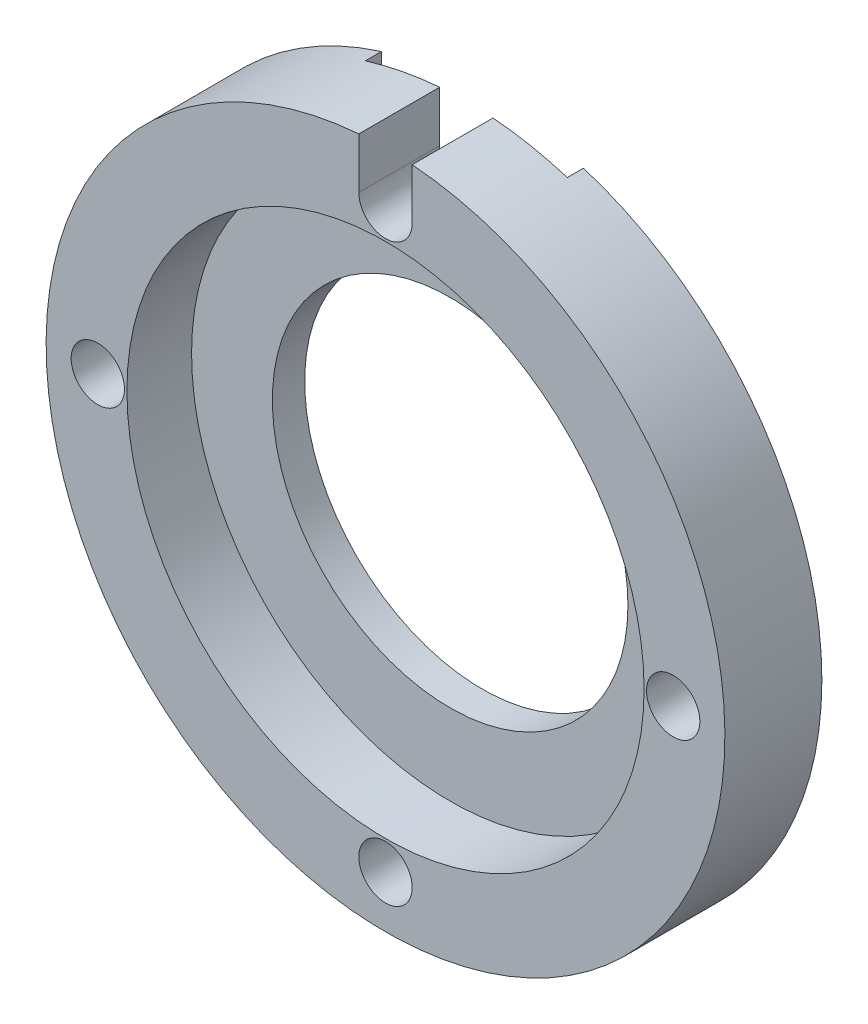
ISO-10303-21;
HEADER;
FILE_DESCRIPTION(('STEP AP214'),'2;1');
FILE_NAME('part.step','',(''),(''),'','','');
FILE_SCHEMA(('AUTOMOTIVE_DESIGN { 1 0 10303 214 1 1 1 1 }'));
ENDSEC;
DATA;
#1=APPLICATION_CONTEXT('core data for automotive mechanical design processes');
#2=APPLICATION_PROTOCOL_DEFINITION('international standard','automotive_design',2000,#1);
#3=PRODUCT_CONTEXT('',#1,'mechanical');
#4=PRODUCT('Part','Part','',(#3));
#5=PRODUCT_RELATED_PRODUCT_CATEGORY('part','',(#4));
#6=PRODUCT_DEFINITION_FORMATION('','',#4);
#7=PRODUCT_DEFINITION_CONTEXT('part definition',#1,'design');
#8=PRODUCT_DEFINITION('design','',#6,#7);
#9=PRODUCT_DEFINITION_SHAPE('','',#8);
#10=(LENGTH_UNIT() NAMED_UNIT(*) SI_UNIT(.MILLI.,.METRE.));
#11=(NAMED_UNIT(*) PLANE_ANGLE_UNIT() SI_UNIT($,.RADIAN.));
#12=(NAMED_UNIT(*) SI_UNIT($,.STERADIAN.) SOLID_ANGLE_UNIT());
#13=UNCERTAINTY_MEASURE_WITH_UNIT(LENGTH_MEASURE(1.E-05),#10,'distance_accuracy_value','');
#14=(GEOMETRIC_REPRESENTATION_CONTEXT(3) GLOBAL_UNCERTAINTY_ASSIGNED_CONTEXT((#13)) GLOBAL_UNIT_ASSIGNED_CONTEXT((#10,
#11,#12)) REPRESENTATION_CONTEXT('',''));
#15=CARTESIAN_POINT('',(0.,0.,0.));
#16=DIRECTION('',(0.,0.,1.));
#17=DIRECTION('',(1.,0.,0.));
#18=AXIS2_PLACEMENT_3D('',#15,#16,#17);
#19=CARTESIAN_POINT('',(0.,17.8,-0.00100000000000013));
#20=DIRECTION('',(0.,0.,1.));
#21=DIRECTION('',(1.,0.,0.));
#22=AXIS2_PLACEMENT_3D('',#19,#20,#21);
#23=CYLINDRICAL_SURFACE('',#22,1.65);
#24=CARTESIAN_POINT('',(0.,17.8,1.));
#25=DIRECTION('',(0.,0.,-1.));
#26=DIRECTION('',(-1.,0.,0.));
#27=AXIS2_PLACEMENT_3D('',#24,#25,#26);
#28=CIRCLE('',#27,1.65);
#29=CARTESIAN_POINT('',(-1.64999999999999,17.8,1.));
#30=VERTEX_POINT('',#29);
#31=CARTESIAN_POINT('',(1.65,17.8,1.));
#32=VERTEX_POINT('',#31);
#33=EDGE_CURVE('E137',#30,#32,#28,.F.);
#34=ORIENTED_EDGE('',*,*,#33,.F.);
#35=DIRECTION('',(0.,0.,1.));
#36=VECTOR('',#35,1.);
#37=CARTESIAN_POINT('',(-1.64999999999999,17.8,-0.00100000000000013));
#38=LINE('',#37,#36);
#39=CARTESIAN_POINT('',(-1.64999999999999,17.8,6.));
#40=VERTEX_POINT('',#39);
#41=EDGE_CURVE('E63',#30,#40,#38,.T.);
#42=ORIENTED_EDGE('',*,*,#41,.T.);
#43=CARTESIAN_POINT('',(0.,17.8,6.));
#44=DIRECTION('',(0.,0.,1.));
#45=DIRECTION('',(1.,0.,0.));
#46=AXIS2_PLACEMENT_3D('',#43,#44,#45);
#47=CIRCLE('',#46,1.65);
#48=CARTESIAN_POINT('',(1.65,17.8,6.));
#49=VERTEX_POINT('',#48);
#50=EDGE_CURVE('E149',#40,#49,#47,.T.);
#51=ORIENTED_EDGE('',*,*,#50,.T.);
#52=DIRECTION('',(0.,0.,1.));
#53=VECTOR('',#52,1.);
#54=CARTESIAN_POINT('',(1.65,17.8,-0.00100000000000013));
#55=LINE('',#54,#53);
#56=EDGE_CURVE('E147',#32,#49,#55,.T.);
#57=ORIENTED_EDGE('',*,*,#56,.F.);
#58=EDGE_LOOP('',(#34,#42,#51,#57));
#59=FACE_BOUND('',#58,.T.);
#60=ADVANCED_FACE('F41',(#59),#23,.F.);
#61=CARTESIAN_POINT('',(1.65,17.8,-0.00100000000000013));
#62=DIRECTION('',(1.,0.,0.));
#63=DIRECTION('',(0.,0.,-1.));
#64=AXIS2_PLACEMENT_3D('',#61,#62,#63);
#65=PLANE('',#64);
#66=DIRECTION('',(0.,1.,0.));
#67=VECTOR('',#66,1.);
#68=CARTESIAN_POINT('',(1.65,17.8,1.));
#69=LINE('',#68,#67);
#70=CARTESIAN_POINT('',(1.65,20.9350782181486,1.));
#71=VERTEX_POINT('',#70);
#72=EDGE_CURVE('E139',#32,#71,#69,.T.);
#73=ORIENTED_EDGE('',*,*,#72,.F.);
#74=ORIENTED_EDGE('',*,*,#56,.T.);
#75=DIRECTION('',(0.,1.,0.));
#76=VECTOR('',#75,1.);
#77=CARTESIAN_POINT('',(1.65,17.8,6.));
#78=LINE('',#77,#76);
#79=CARTESIAN_POINT('',(1.65,20.9350782181486,6.));
#80=VERTEX_POINT('',#79);
#81=EDGE_CURVE('E142',#49,#80,#78,.T.);
#82=ORIENTED_EDGE('',*,*,#81,.T.);
#83=DIRECTION('',(0.,0.,1.));
#84=VECTOR('',#83,1.);
#85=CARTESIAN_POINT('',(1.65,20.9350782181486,-0.00100000000000013));
#86=LINE('',#85,#84);
#87=EDGE_CURVE('E152',#71,#80,#86,.T.);
#88=ORIENTED_EDGE('',*,*,#87,.F.);
#89=EDGE_LOOP('',(#73,#74,#82,#88));
#90=FACE_BOUND('',#89,.T.);
#91=ADVANCED_FACE('F210',(#90),#65,.F.);
#92=CARTESIAN_POINT('',(-1.64999999999999,17.8,-0.00100000000000013));
#93=DIRECTION('',(-1.,0.,0.));
#94=DIRECTION('',(0.,0.,1.));
#95=AXIS2_PLACEMENT_3D('',#92,#93,#94);
#96=PLANE('',#95);
#97=DIRECTION('',(0.,-1.,0.));
#98=VECTOR('',#97,1.);
#99=CARTESIAN_POINT('',(-1.64999999999999,17.8,1.));
#100=LINE('',#99,#98);
#101=CARTESIAN_POINT('',(-1.64999999999999,20.9350782181486,1.));
#102=VERTEX_POINT('',#101);
#103=EDGE_CURVE('E11',#102,#30,#100,.T.);
#104=ORIENTED_EDGE('',*,*,#103,.F.);
#105=DIRECTION('',(0.,0.,1.));
#106=VECTOR('',#105,1.);
#107=CARTESIAN_POINT('',(-1.64999999999999,20.9350782181486,-0.00100000000000013));
#108=LINE('',#107,#106);
#109=CARTESIAN_POINT('',(-1.64999999999999,20.9350782181486,6.));
#110=VERTEX_POINT('',#109);
#111=EDGE_CURVE('E150',#102,#110,#108,.T.);
#112=ORIENTED_EDGE('',*,*,#111,.T.);
#113=DIRECTION('',(0.,-1.,0.));
#114=VECTOR('',#113,1.);
#115=CARTESIAN_POINT('',(-1.64999999999999,17.8,6.));
#116=LINE('',#115,#114);
#117=EDGE_CURVE('E145',#110,#40,#116,.T.);
#118=ORIENTED_EDGE('',*,*,#117,.T.);
#119=ORIENTED_EDGE('',*,*,#41,.F.);
#120=EDGE_LOOP('',(#104,#112,#118,#119));
#121=FACE_BOUND('',#120,.T.);
#122=ADVANCED_FACE('F216',(#121),#96,.F.);
#123=CARTESIAN_POINT('',(0.,0.,2.));
#124=DIRECTION('',(0.,0.,1.));
#125=DIRECTION('',(1.,0.,0.));
#126=AXIS2_PLACEMENT_3D('',#123,#124,#125);
#127=PLANE('',#126);
#128=CARTESIAN_POINT('',(0.,0.,2.));
#129=DIRECTION('',(0.,0.,1.));
#130=DIRECTION('',(1.,0.,0.));
#131=AXIS2_PLACEMENT_3D('',#128,#129,#130);
#132=CIRCLE('',#131,11.);
#133=CARTESIAN_POINT('',(11.,0.,2.));
#134=VERTEX_POINT('',#133);
#135=EDGE_CURVE('E183',#134,#134,#132,.T.);
#136=ORIENTED_EDGE('',*,*,#135,.F.);
#137=EDGE_LOOP('',(#136));
#138=FACE_BOUND('',#137,.T.);
#139=CARTESIAN_POINT('',(0.,0.,2.));
#140=DIRECTION('',(0.,0.,1.));
#141=DIRECTION('',(1.,0.,0.));
#142=AXIS2_PLACEMENT_3D('',#139,#140,#141);
#143=CIRCLE('',#142,16.);
#144=CARTESIAN_POINT('',(16.,0.,2.));
#145=VERTEX_POINT('',#144);
#146=EDGE_CURVE('E162',#145,#145,#143,.T.);
#147=ORIENTED_EDGE('',*,*,#146,.T.);
#148=EDGE_LOOP('',(#147));
#149=FACE_BOUND('',#148,.T.);
#150=ADVANCED_FACE('F232',(#138,#149),#127,.T.);
#151=CARTESIAN_POINT('',(0.,0.,0.));
#152=DIRECTION('',(0.,0.,1.));
#153=DIRECTION('',(1.,0.,0.));
#154=AXIS2_PLACEMENT_3D('',#151,#152,#153);
#155=PLANE('',#154);
#156=CARTESIAN_POINT('',(17.8,0.,0.));
#157=DIRECTION('',(0.,0.,1.));
#158=DIRECTION('',(1.,0.,0.));
#159=AXIS2_PLACEMENT_3D('',#156,#157,#158);
#160=CIRCLE('',#159,1.65);
#161=CARTESIAN_POINT('',(19.45,0.,0.));
#162=VERTEX_POINT('',#161);
#163=EDGE_CURVE('E158',#162,#162,#160,.F.);
#164=ORIENTED_EDGE('',*,*,#163,.F.);
#165=EDGE_LOOP('',(#164));
#166=FACE_BOUND('',#165,.T.);
#167=CARTESIAN_POINT('',(0.,-17.8,0.));
#168=DIRECTION('',(0.,0.,1.));
#169=DIRECTION('',(1.,0.,0.));
#170=AXIS2_PLACEMENT_3D('',#167,#168,#169);
#171=CIRCLE('',#170,1.65);
#172=CARTESIAN_POINT('',(1.65,-17.8,0.));
#173=VERTEX_POINT('',#172);
#174=EDGE_CURVE('E163',#173,#173,#171,.F.);
#175=ORIENTED_EDGE('',*,*,#174,.F.);
#176=EDGE_LOOP('',(#175));
#177=FACE_BOUND('',#176,.T.);
#178=CARTESIAN_POINT('',(-17.8,0.,0.));
#179=DIRECTION('',(0.,0.,1.));
#180=DIRECTION('',(1.,0.,0.));
#181=AXIS2_PLACEMENT_3D('',#178,#179,#180);
#182=CIRCLE('',#181,1.65);
#183=CARTESIAN_POINT('',(-16.15,0.,0.));
#184=VERTEX_POINT('',#183);
#185=EDGE_CURVE('E169',#184,#184,#182,.F.);
#186=ORIENTED_EDGE('',*,*,#185,.F.);
#187=EDGE_LOOP('',(#186));
#188=FACE_BOUND('',#187,.T.);
#189=CARTESIAN_POINT('',(0.,0.,0.));
#190=DIRECTION('',(0.,0.,1.));
#191=DIRECTION('',(1.,0.,0.));
#192=AXIS2_PLACEMENT_3D('',#189,#190,#191);
#193=CIRCLE('',#192,11.);
#194=CARTESIAN_POINT('',(-6.24999999999999,9.05193349511584,0.));
#195=VERTEX_POINT('',#194);
#196=CARTESIAN_POINT('',(6.25000000000002,9.05193349511582,0.));
#197=VERTEX_POINT('',#196);
#198=EDGE_CURVE('E130',#195,#197,#193,.T.);
#199=ORIENTED_EDGE('',*,*,#198,.T.);
#200=DIRECTION('',(0.,-1.,0.));
#201=VECTOR('',#200,1.);
#202=CARTESIAN_POINT('',(6.25000000000002,9.05193349511582,0.));
#203=LINE('',#202,#201);
#204=CARTESIAN_POINT('',(6.25000000000001,20.0483789868408,0.));
#205=VERTEX_POINT('',#204);
#206=EDGE_CURVE('E124',#205,#197,#203,.T.);
#207=ORIENTED_EDGE('',*,*,#206,.F.);
#208=CARTESIAN_POINT('',(0.,0.,0.));
#209=DIRECTION('',(0.,0.,1.));
#210=DIRECTION('',(1.,0.,0.));
#211=AXIS2_PLACEMENT_3D('',#208,#209,#210);
#212=CIRCLE('',#211,21.);
#213=CARTESIAN_POINT('',(-6.24999999999999,20.0483789868408,0.));
#214=VERTEX_POINT('',#213);
#215=EDGE_CURVE('E49',#214,#205,#212,.T.);
#216=ORIENTED_EDGE('',*,*,#215,.F.);
#217=DIRECTION('',(0.,1.,0.));
#218=VECTOR('',#217,1.);
#219=CARTESIAN_POINT('',(-6.24999999999999,9.05193349511584,0.));
#220=LINE('',#219,#218);
#221=EDGE_CURVE('E194',#195,#214,#220,.T.);
#222=ORIENTED_EDGE('',*,*,#221,.F.);
#223=EDGE_LOOP('',(#199,#207,#216,#222));
#224=FACE_BOUND('',#223,.T.);
#225=ADVANCED_FACE('F193',(#166,#177,#188,#224),#155,.F.);
#226=CARTESIAN_POINT('',(0.,0.,2.));
#227=DIRECTION('',(0.,0.,-1.));
#228=DIRECTION('',(-1.,0.,0.));
#229=AXIS2_PLACEMENT_3D('',#226,#227,#228);
#230=CYLINDRICAL_SURFACE('',#229,21.);
#231=CARTESIAN_POINT('',(0.,0.,1.));
#232=DIRECTION('',(0.,0.,-1.));
#233=DIRECTION('',(-1.,0.,0.));
#234=AXIS2_PLACEMENT_3D('',#231,#232,#233);
#235=CIRCLE('',#234,21.);
#236=CARTESIAN_POINT('',(-6.24999999999999,20.0483789868408,1.));
#237=VERTEX_POINT('',#236);
#238=EDGE_CURVE('E55',#237,#102,#235,.T.);
#239=ORIENTED_EDGE('',*,*,#238,.F.);
#240=DIRECTION('',(0.,0.,-1.));
#241=VECTOR('',#240,1.);
#242=CARTESIAN_POINT('',(-6.24999999999999,20.0483789868408,1.));
#243=LINE('',#242,#241);
#244=EDGE_CURVE('E113',#237,#214,#243,.T.);
#245=ORIENTED_EDGE('',*,*,#244,.T.);
#246=ORIENTED_EDGE('',*,*,#215,.T.);
#247=DIRECTION('',(0.,0.,-1.));
#248=VECTOR('',#247,1.);
#249=CARTESIAN_POINT('',(6.25000000000001,20.0483789868408,1.));
#250=LINE('',#249,#248);
#251=CARTESIAN_POINT('',(6.25000000000001,20.0483789868408,1.));
#252=VERTEX_POINT('',#251);
#253=EDGE_CURVE('E132',#252,#205,#250,.T.);
#254=ORIENTED_EDGE('',*,*,#253,.F.);
#255=EDGE_CURVE('E114',#71,#252,#235,.T.);
#256=ORIENTED_EDGE('',*,*,#255,.F.);
#257=ORIENTED_EDGE('',*,*,#87,.T.);
#258=CARTESIAN_POINT('',(0.,0.,6.));
#259=DIRECTION('',(0.,0.,1.));
#260=DIRECTION('',(1.,0.,0.));
#261=AXIS2_PLACEMENT_3D('',#258,#259,#260);
#262=CIRCLE('',#261,21.);
#263=EDGE_CURVE('E178',#110,#80,#262,.T.);
#264=ORIENTED_EDGE('',*,*,#263,.F.);
#265=ORIENTED_EDGE('',*,*,#111,.F.);
#266=EDGE_LOOP('',(#239,#245,#246,#254,#256,#257,#264,#265));
#267=FACE_BOUND('',#266,.T.);
#268=ADVANCED_FACE('F43',(#267),#230,.T.);
#269=CARTESIAN_POINT('',(0.,0.,2.));
#270=DIRECTION('',(0.,0.,-1.));
#271=DIRECTION('',(-1.,0.,0.));
#272=AXIS2_PLACEMENT_3D('',#269,#270,#271);
#273=CYLINDRICAL_SURFACE('',#272,11.);
#274=DIRECTION('',(0.,0.,-1.));
#275=VECTOR('',#274,1.);
#276=CARTESIAN_POINT('',(6.25000000000002,9.05193349511582,1.));
#277=LINE('',#276,#275);
#278=CARTESIAN_POINT('',(6.25000000000002,9.05193349511582,1.));
#279=VERTEX_POINT('',#278);
#280=EDGE_CURVE('E140',#279,#197,#277,.T.);
#281=ORIENTED_EDGE('',*,*,#280,.T.);
#282=ORIENTED_EDGE('',*,*,#198,.F.);
#283=DIRECTION('',(0.,0.,-1.));
#284=VECTOR('',#283,1.);
#285=CARTESIAN_POINT('',(-6.24999999999999,9.05193349511584,1.));
#286=LINE('',#285,#284);
#287=CARTESIAN_POINT('',(-6.24999999999999,9.05193349511584,1.));
#288=VERTEX_POINT('',#287);
#289=EDGE_CURVE('E110',#288,#195,#286,.T.);
#290=ORIENTED_EDGE('',*,*,#289,.F.);
#291=CARTESIAN_POINT('',(0.,0.,1.));
#292=DIRECTION('',(0.,0.,1.));
#293=DIRECTION('',(-1.,0.,0.));
#294=AXIS2_PLACEMENT_3D('',#291,#292,#293);
#295=CIRCLE('',#294,11.);
#296=EDGE_CURVE('E115',#279,#288,#295,.T.);
#297=ORIENTED_EDGE('',*,*,#296,.F.);
#298=EDGE_LOOP('',(#281,#282,#290,#297));
#299=FACE_BOUND('',#298,.T.);
#300=ORIENTED_EDGE('',*,*,#135,.T.);
#301=EDGE_LOOP('',(#300));
#302=FACE_BOUND('',#301,.T.);
#303=ADVANCED_FACE('F127',(#299,#302),#273,.F.);
#304=CARTESIAN_POINT('',(0.,0.,6.));
#305=DIRECTION('',(0.,0.,1.));
#306=DIRECTION('',(1.,0.,0.));
#307=AXIS2_PLACEMENT_3D('',#304,#305,#306);
#308=PLANE('',#307);
#309=ORIENTED_EDGE('',*,*,#117,.F.);
#310=ORIENTED_EDGE('',*,*,#263,.T.);
#311=ORIENTED_EDGE('',*,*,#81,.F.);
#312=ORIENTED_EDGE('',*,*,#50,.F.);
#313=EDGE_LOOP('',(#309,#310,#311,#312));
#314=FACE_BOUND('',#313,.T.);
#315=CARTESIAN_POINT('',(17.8,0.,6.));
#316=DIRECTION('',(0.,0.,1.));
#317=DIRECTION('',(1.,0.,0.));
#318=AXIS2_PLACEMENT_3D('',#315,#316,#317);
#319=CIRCLE('',#318,1.65);
#320=CARTESIAN_POINT('',(19.45,0.,6.));
#321=VERTEX_POINT('',#320);
#322=EDGE_CURVE('E155',#321,#321,#319,.T.);
#323=ORIENTED_EDGE('',*,*,#322,.F.);
#324=EDGE_LOOP('',(#323));
#325=FACE_BOUND('',#324,.T.);
#326=CARTESIAN_POINT('',(0.,-17.8,6.));
#327=DIRECTION('',(0.,0.,1.));
#328=DIRECTION('',(1.,0.,0.));
#329=AXIS2_PLACEMENT_3D('',#326,#327,#328);
#330=CIRCLE('',#329,1.65);
#331=CARTESIAN_POINT('',(1.65,-17.8,6.));
#332=VERTEX_POINT('',#331);
#333=EDGE_CURVE('E159',#332,#332,#330,.T.);
#334=ORIENTED_EDGE('',*,*,#333,.F.);
#335=EDGE_LOOP('',(#334));
#336=FACE_BOUND('',#335,.T.);
#337=CARTESIAN_POINT('',(-17.8,0.,6.));
#338=DIRECTION('',(0.,0.,1.));
#339=DIRECTION('',(1.,0.,0.));
#340=AXIS2_PLACEMENT_3D('',#337,#338,#339);
#341=CIRCLE('',#340,1.65);
#342=CARTESIAN_POINT('',(-16.15,0.,6.));
#343=VERTEX_POINT('',#342);
#344=EDGE_CURVE('E166',#343,#343,#341,.T.);
#345=ORIENTED_EDGE('',*,*,#344,.F.);
#346=EDGE_LOOP('',(#345));
#347=FACE_BOUND('',#346,.T.);
#348=CARTESIAN_POINT('',(0.,0.,6.));
#349=DIRECTION('',(0.,0.,1.));
#350=DIRECTION('',(1.,0.,0.));
#351=AXIS2_PLACEMENT_3D('',#348,#349,#350);
#352=CIRCLE('',#351,16.);
#353=CARTESIAN_POINT('',(16.,0.,6.));
#354=VERTEX_POINT('',#353);
#355=EDGE_CURVE('E175',#354,#354,#352,.T.);
#356=ORIENTED_EDGE('',*,*,#355,.F.);
#357=EDGE_LOOP('',(#356));
#358=FACE_BOUND('',#357,.T.);
#359=ADVANCED_FACE('F226',(#314,#325,#336,#347,#358),#308,.T.);
#360=CARTESIAN_POINT('',(0.,0.,6.));
#361=DIRECTION('',(0.,0.,-1.));
#362=DIRECTION('',(-1.,0.,0.));
#363=AXIS2_PLACEMENT_3D('',#360,#361,#362);
#364=CYLINDRICAL_SURFACE('',#363,16.);
#365=ORIENTED_EDGE('',*,*,#355,.T.);
#366=EDGE_LOOP('',(#365));
#367=FACE_BOUND('',#366,.T.);
#368=ORIENTED_EDGE('',*,*,#146,.F.);
#369=EDGE_LOOP('',(#368));
#370=FACE_BOUND('',#369,.T.);
#371=ADVANCED_FACE('F223',(#367,#370),#364,.F.);
#372=CARTESIAN_POINT('',(-17.8,0.,-0.00100000000000013));
#373=DIRECTION('',(0.,0.,1.));
#374=DIRECTION('',(1.,0.,0.));
#375=AXIS2_PLACEMENT_3D('',#372,#373,#374);
#376=CYLINDRICAL_SURFACE('',#375,1.65);
#377=CARTESIAN_POINT('',(-16.15,0.,6.));
#378=CARTESIAN_POINT('',(-16.15,0.,5.9375));
#379=CARTESIAN_POINT('',(-16.15,0.,5.875));
#380=CARTESIAN_POINT('',(-16.15,0.,5.75));
#381=CARTESIAN_POINT('',(-16.15,0.,5.6875));
#382=CARTESIAN_POINT('',(-16.15,0.,5.5625));
#383=CARTESIAN_POINT('',(-16.15,0.,5.5));
#384=CARTESIAN_POINT('',(-16.15,0.,5.375));
#385=CARTESIAN_POINT('',(-16.15,0.,5.3125));
#386=CARTESIAN_POINT('',(-16.15,0.,5.1875));
#387=CARTESIAN_POINT('',(-16.15,0.,5.125));
#388=CARTESIAN_POINT('',(-16.15,0.,5.));
#389=CARTESIAN_POINT('',(-16.15,0.,4.9375));
#390=CARTESIAN_POINT('',(-16.15,0.,4.8125));
#391=CARTESIAN_POINT('',(-16.15,0.,4.75));
#392=CARTESIAN_POINT('',(-16.15,0.,4.625));
#393=CARTESIAN_POINT('',(-16.15,0.,4.5625));
#394=CARTESIAN_POINT('',(-16.15,0.,4.4375));
#395=CARTESIAN_POINT('',(-16.15,0.,4.375));
#396=CARTESIAN_POINT('',(-16.15,0.,4.25));
#397=CARTESIAN_POINT('',(-16.15,0.,4.1875));
#398=CARTESIAN_POINT('',(-16.15,0.,4.0625));
#399=CARTESIAN_POINT('',(-16.15,0.,4.));
#400=CARTESIAN_POINT('',(-16.15,0.,3.875));
#401=CARTESIAN_POINT('',(-16.15,0.,3.8125));
#402=CARTESIAN_POINT('',(-16.15,0.,3.6875));
#403=CARTESIAN_POINT('',(-16.15,0.,3.625));
#404=CARTESIAN_POINT('',(-16.15,0.,3.5));
#405=CARTESIAN_POINT('',(-16.15,0.,3.4375));
#406=CARTESIAN_POINT('',(-16.15,0.,3.3125));
#407=CARTESIAN_POINT('',(-16.15,0.,3.25));
#408=CARTESIAN_POINT('',(-16.15,0.,3.125));
#409=CARTESIAN_POINT('',(-16.15,0.,3.0625));
#410=CARTESIAN_POINT('',(-16.15,0.,2.9375));
#411=CARTESIAN_POINT('',(-16.15,0.,2.875));
#412=CARTESIAN_POINT('',(-16.15,0.,2.75));
#413=CARTESIAN_POINT('',(-16.15,0.,2.6875));
#414=CARTESIAN_POINT('',(-16.15,0.,2.5625));
#415=CARTESIAN_POINT('',(-16.15,0.,2.5));
#416=CARTESIAN_POINT('',(-16.15,0.,2.375));
#417=CARTESIAN_POINT('',(-16.15,0.,2.3125));
#418=CARTESIAN_POINT('',(-16.15,0.,2.1875));
#419=CARTESIAN_POINT('',(-16.15,0.,2.125));
#420=CARTESIAN_POINT('',(-16.15,0.,2.));
#421=CARTESIAN_POINT('',(-16.15,0.,1.9375));
#422=CARTESIAN_POINT('',(-16.15,0.,1.8125));
#423=CARTESIAN_POINT('',(-16.15,0.,1.75));
#424=CARTESIAN_POINT('',(-16.15,0.,1.625));
#425=CARTESIAN_POINT('',(-16.15,0.,1.5625));
#426=CARTESIAN_POINT('',(-16.15,0.,1.4375));
#427=CARTESIAN_POINT('',(-16.15,0.,1.375));
#428=CARTESIAN_POINT('',(-16.15,0.,1.25));
#429=CARTESIAN_POINT('',(-16.15,0.,1.1875));
#430=CARTESIAN_POINT('',(-16.15,0.,1.0625));
#431=CARTESIAN_POINT('',(-16.15,0.,1.));
#432=CARTESIAN_POINT('',(-16.15,0.,0.875));
#433=CARTESIAN_POINT('',(-16.15,0.,0.8125));
#434=CARTESIAN_POINT('',(-16.15,0.,0.6875));
#435=CARTESIAN_POINT('',(-16.15,0.,0.625));
#436=CARTESIAN_POINT('',(-16.15,0.,0.5));
#437=CARTESIAN_POINT('',(-16.15,0.,0.4375));
#438=CARTESIAN_POINT('',(-16.15,0.,0.3125));
#439=CARTESIAN_POINT('',(-16.15,0.,0.25));
#440=CARTESIAN_POINT('',(-16.15,0.,0.125));
#441=CARTESIAN_POINT('',(-16.15,0.,0.0625000000000001));
#442=CARTESIAN_POINT('',(-16.15,0.,0.));
#443=B_SPLINE_CURVE_WITH_KNOTS('',3,(#377,#378,#379,#380,#381,#382,#383,#384,#385,#386,#387,
#388,#389,#390,#391,#392,#393,#394,#395,#396,#397,#398,#399,#400,#401,#402,#403,#404,#405,#406,
#407,#408,#409,#410,#411,#412,#413,#414,#415,#416,#417,#418,#419,#420,#421,#422,#423,#424,#425,
#426,#427,#428,#429,#430,#431,#432,#433,#434,#435,#436,#437,#438,#439,#440,#441,#442),
.UNSPECIFIED.,.F.,.F.,(4,2,2,2,2,2,2,2,2,2,2,2,2,2,2,2,2,2,2,2,2,2,2,2,2,2,2,2,2,2,2,2,4),(0.,
0.1875,0.375,0.5625,0.75,0.9375,1.125,1.3125,1.5,1.6875,1.875,2.0625,2.25,2.4375,2.625,2.8125,
3.,3.1875,3.375,3.5625,3.75,3.9375,4.125,4.3125,4.5,4.6875,4.875,5.0625,5.25,5.4375,5.625,
5.8125,6.),.UNSPECIFIED.);
#444=EDGE_CURVE('BSEAM221',#343,#184,#443,.T.);
#445=ORIENTED_EDGE('',*,*,#344,.T.);
#446=ORIENTED_EDGE('',*,*,#185,.T.);
#447=ORIENTED_EDGE('',*,*,#444,.T.);
#448=ORIENTED_EDGE('',*,*,#444,.F.);
#449=EDGE_LOOP('',(#445,#447,#446,#448));
#450=FACE_BOUND('',#449,.T.);
#451=ADVANCED_FACE('F221',(#450),#376,.F.);
#452=CARTESIAN_POINT('',(0.,-17.8,-0.00100000000000013));
#453=DIRECTION('',(0.,0.,1.));
#454=DIRECTION('',(1.,0.,0.));
#455=AXIS2_PLACEMENT_3D('',#452,#453,#454);
#456=CYLINDRICAL_SURFACE('',#455,1.65);
#457=CARTESIAN_POINT('',(1.65,-17.8,6.));
#458=CARTESIAN_POINT('',(1.65,-17.8,5.9375));
#459=CARTESIAN_POINT('',(1.65,-17.8,5.875));
#460=CARTESIAN_POINT('',(1.65,-17.8,5.75));
#461=CARTESIAN_POINT('',(1.65,-17.8,5.6875));
#462=CARTESIAN_POINT('',(1.65,-17.8,5.5625));
#463=CARTESIAN_POINT('',(1.65,-17.8,5.5));
#464=CARTESIAN_POINT('',(1.65,-17.8,5.375));
#465=CARTESIAN_POINT('',(1.65,-17.8,5.3125));
#466=CARTESIAN_POINT('',(1.65,-17.8,5.1875));
#467=CARTESIAN_POINT('',(1.65,-17.8,5.125));
#468=CARTESIAN_POINT('',(1.65,-17.8,5.));
#469=CARTESIAN_POINT('',(1.65,-17.8,4.9375));
#470=CARTESIAN_POINT('',(1.65,-17.8,4.8125));
#471=CARTESIAN_POINT('',(1.65,-17.8,4.75));
#472=CARTESIAN_POINT('',(1.65,-17.8,4.625));
#473=CARTESIAN_POINT('',(1.65,-17.8,4.5625));
#474=CARTESIAN_POINT('',(1.65,-17.8,4.4375));
#475=CARTESIAN_POINT('',(1.65,-17.8,4.375));
#476=CARTESIAN_POINT('',(1.65,-17.8,4.25));
#477=CARTESIAN_POINT('',(1.65,-17.8,4.1875));
#478=CARTESIAN_POINT('',(1.65,-17.8,4.0625));
#479=CARTESIAN_POINT('',(1.65,-17.8,4.));
#480=CARTESIAN_POINT('',(1.65,-17.8,3.875));
#481=CARTESIAN_POINT('',(1.65,-17.8,3.8125));
#482=CARTESIAN_POINT('',(1.65,-17.8,3.6875));
#483=CARTESIAN_POINT('',(1.65,-17.8,3.625));
#484=CARTESIAN_POINT('',(1.65,-17.8,3.5));
#485=CARTESIAN_POINT('',(1.65,-17.8,3.4375));
#486=CARTESIAN_POINT('',(1.65,-17.8,3.3125));
#487=CARTESIAN_POINT('',(1.65,-17.8,3.25));
#488=CARTESIAN_POINT('',(1.65,-17.8,3.125));
#489=CARTESIAN_POINT('',(1.65,-17.8,3.0625));
#490=CARTESIAN_POINT('',(1.65,-17.8,2.9375));
#491=CARTESIAN_POINT('',(1.65,-17.8,2.875));
#492=CARTESIAN_POINT('',(1.65,-17.8,2.75));
#493=CARTESIAN_POINT('',(1.65,-17.8,2.6875));
#494=CARTESIAN_POINT('',(1.65,-17.8,2.5625));
#495=CARTESIAN_POINT('',(1.65,-17.8,2.5));
#496=CARTESIAN_POINT('',(1.65,-17.8,2.375));
#497=CARTESIAN_POINT('',(1.65,-17.8,2.3125));
#498=CARTESIAN_POINT('',(1.65,-17.8,2.1875));
#499=CARTESIAN_POINT('',(1.65,-17.8,2.125));
#500=CARTESIAN_POINT('',(1.65,-17.8,2.));
#501=CARTESIAN_POINT('',(1.65,-17.8,1.9375));
#502=CARTESIAN_POINT('',(1.65,-17.8,1.8125));
#503=CARTESIAN_POINT('',(1.65,-17.8,1.75));
#504=CARTESIAN_POINT('',(1.65,-17.8,1.625));
#505=CARTESIAN_POINT('',(1.65,-17.8,1.5625));
#506=CARTESIAN_POINT('',(1.65,-17.8,1.4375));
#507=CARTESIAN_POINT('',(1.65,-17.8,1.375));
#508=CARTESIAN_POINT('',(1.65,-17.8,1.25));
#509=CARTESIAN_POINT('',(1.65,-17.8,1.1875));
#510=CARTESIAN_POINT('',(1.65,-17.8,1.0625));
#511=CARTESIAN_POINT('',(1.65,-17.8,1.));
#512=CARTESIAN_POINT('',(1.65,-17.8,0.875));
#513=CARTESIAN_POINT('',(1.65,-17.8,0.8125));
#514=CARTESIAN_POINT('',(1.65,-17.8,0.6875));
#515=CARTESIAN_POINT('',(1.65,-17.8,0.625));
#516=CARTESIAN_POINT('',(1.65,-17.8,0.5));
#517=CARTESIAN_POINT('',(1.65,-17.8,0.4375));
#518=CARTESIAN_POINT('',(1.65,-17.8,0.3125));
#519=CARTESIAN_POINT('',(1.65,-17.8,0.25));
#520=CARTESIAN_POINT('',(1.65,-17.8,0.125));
#521=CARTESIAN_POINT('',(1.65,-17.8,0.0625000000000001));
#522=CARTESIAN_POINT('',(1.65,-17.8,0.));
#523=B_SPLINE_CURVE_WITH_KNOTS('',3,(#457,#458,#459,#460,#461,#462,#463,#464,#465,#466,#467,
#468,#469,#470,#471,#472,#473,#474,#475,#476,#477,#478,#479,#480,#481,#482,#483,#484,#485,#486,
#487,#488,#489,#490,#491,#492,#493,#494,#495,#496,#497,#498,#499,#500,#501,#502,#503,#504,#505,
#506,#507,#508,#509,#510,#511,#512,#513,#514,#515,#516,#517,#518,#519,#520,#521,#522),
.UNSPECIFIED.,.F.,.F.,(4,2,2,2,2,2,2,2,2,2,2,2,2,2,2,2,2,2,2,2,2,2,2,2,2,2,2,2,2,2,2,2,4),(0.,
0.1875,0.375,0.5625,0.75,0.9375,1.125,1.3125,1.5,1.6875,1.875,2.0625,2.25,2.4375,2.625,2.8125,
3.,3.1875,3.375,3.5625,3.75,3.9375,4.125,4.3125,4.5,4.6875,4.875,5.0625,5.25,5.4375,5.625,
5.8125,6.),.UNSPECIFIED.);
#524=EDGE_CURVE('BSEAM248',#332,#173,#523,.T.);
#525=ORIENTED_EDGE('',*,*,#333,.T.);
#526=ORIENTED_EDGE('',*,*,#174,.T.);
#527=ORIENTED_EDGE('',*,*,#524,.T.);
#528=ORIENTED_EDGE('',*,*,#524,.F.);
#529=EDGE_LOOP('',(#525,#527,#526,#528));
#530=FACE_BOUND('',#529,.T.);
#531=ADVANCED_FACE('F248',(#530),#456,.F.);
#532=CARTESIAN_POINT('',(17.8,0.,-0.00100000000000013));
#533=DIRECTION('',(0.,0.,1.));
#534=DIRECTION('',(1.,0.,0.));
#535=AXIS2_PLACEMENT_3D('',#532,#533,#534);
#536=CYLINDRICAL_SURFACE('',#535,1.65);
#537=CARTESIAN_POINT('',(19.45,0.,6.));
#538=CARTESIAN_POINT('',(19.45,0.,5.9375));
#539=CARTESIAN_POINT('',(19.45,0.,5.875));
#540=CARTESIAN_POINT('',(19.45,0.,5.75));
#541=CARTESIAN_POINT('',(19.45,0.,5.6875));
#542=CARTESIAN_POINT('',(19.45,0.,5.5625));
#543=CARTESIAN_POINT('',(19.45,0.,5.5));
#544=CARTESIAN_POINT('',(19.45,0.,5.375));
#545=CARTESIAN_POINT('',(19.45,0.,5.3125));
#546=CARTESIAN_POINT('',(19.45,0.,5.1875));
#547=CARTESIAN_POINT('',(19.45,0.,5.125));
#548=CARTESIAN_POINT('',(19.45,0.,5.));
#549=CARTESIAN_POINT('',(19.45,0.,4.9375));
#550=CARTESIAN_POINT('',(19.45,0.,4.8125));
#551=CARTESIAN_POINT('',(19.45,0.,4.75));
#552=CARTESIAN_POINT('',(19.45,0.,4.625));
#553=CARTESIAN_POINT('',(19.45,0.,4.5625));
#554=CARTESIAN_POINT('',(19.45,0.,4.4375));
#555=CARTESIAN_POINT('',(19.45,0.,4.375));
#556=CARTESIAN_POINT('',(19.45,0.,4.25));
#557=CARTESIAN_POINT('',(19.45,0.,4.1875));
#558=CARTESIAN_POINT('',(19.45,0.,4.0625));
#559=CARTESIAN_POINT('',(19.45,0.,4.));
#560=CARTESIAN_POINT('',(19.45,0.,3.875));
#561=CARTESIAN_POINT('',(19.45,0.,3.8125));
#562=CARTESIAN_POINT('',(19.45,0.,3.6875));
#563=CARTESIAN_POINT('',(19.45,0.,3.625));
#564=CARTESIAN_POINT('',(19.45,0.,3.5));
#565=CARTESIAN_POINT('',(19.45,0.,3.4375));
#566=CARTESIAN_POINT('',(19.45,0.,3.3125));
#567=CARTESIAN_POINT('',(19.45,0.,3.25));
#568=CARTESIAN_POINT('',(19.45,0.,3.125));
#569=CARTESIAN_POINT('',(19.45,0.,3.0625));
#570=CARTESIAN_POINT('',(19.45,0.,2.9375));
#571=CARTESIAN_POINT('',(19.45,0.,2.875));
#572=CARTESIAN_POINT('',(19.45,0.,2.75));
#573=CARTESIAN_POINT('',(19.45,0.,2.6875));
#574=CARTESIAN_POINT('',(19.45,0.,2.5625));
#575=CARTESIAN_POINT('',(19.45,0.,2.5));
#576=CARTESIAN_POINT('',(19.45,0.,2.375));
#577=CARTESIAN_POINT('',(19.45,0.,2.3125));
#578=CARTESIAN_POINT('',(19.45,0.,2.1875));
#579=CARTESIAN_POINT('',(19.45,0.,2.125));
#580=CARTESIAN_POINT('',(19.45,0.,2.));
#581=CARTESIAN_POINT('',(19.45,0.,1.9375));
#582=CARTESIAN_POINT('',(19.45,0.,1.8125));
#583=CARTESIAN_POINT('',(19.45,0.,1.75));
#584=CARTESIAN_POINT('',(19.45,0.,1.625));
#585=CARTESIAN_POINT('',(19.45,0.,1.5625));
#586=CARTESIAN_POINT('',(19.45,0.,1.4375));
#587=CARTESIAN_POINT('',(19.45,0.,1.375));
#588=CARTESIAN_POINT('',(19.45,0.,1.25));
#589=CARTESIAN_POINT('',(19.45,0.,1.1875));
#590=CARTESIAN_POINT('',(19.45,0.,1.0625));
#591=CARTESIAN_POINT('',(19.45,0.,1.));
#592=CARTESIAN_POINT('',(19.45,0.,0.875));
#593=CARTESIAN_POINT('',(19.45,0.,0.8125));
#594=CARTESIAN_POINT('',(19.45,0.,0.6875));
#595=CARTESIAN_POINT('',(19.45,0.,0.625));
#596=CARTESIAN_POINT('',(19.45,0.,0.5));
#597=CARTESIAN_POINT('',(19.45,0.,0.4375));
#598=CARTESIAN_POINT('',(19.45,0.,0.3125));
#599=CARTESIAN_POINT('',(19.45,0.,0.25));
#600=CARTESIAN_POINT('',(19.45,0.,0.125));
#601=CARTESIAN_POINT('',(19.45,0.,0.0625000000000001));
#602=CARTESIAN_POINT('',(19.45,0.,0.));
#603=B_SPLINE_CURVE_WITH_KNOTS('',3,(#537,#538,#539,#540,#541,#542,#543,#544,#545,#546,#547,
#548,#549,#550,#551,#552,#553,#554,#555,#556,#557,#558,#559,#560,#561,#562,#563,#564,#565,#566,
#567,#568,#569,#570,#571,#572,#573,#574,#575,#576,#577,#578,#579,#580,#581,#582,#583,#584,#585,
#586,#587,#588,#589,#590,#591,#592,#593,#594,#595,#596,#597,#598,#599,#600,#601,#602),
.UNSPECIFIED.,.F.,.F.,(4,2,2,2,2,2,2,2,2,2,2,2,2,2,2,2,2,2,2,2,2,2,2,2,2,2,2,2,2,2,2,2,4),(0.,
0.1875,0.375,0.5625,0.75,0.9375,1.125,1.3125,1.5,1.6875,1.875,2.0625,2.25,2.4375,2.625,2.8125,
3.,3.1875,3.375,3.5625,3.75,3.9375,4.125,4.3125,4.5,4.6875,4.875,5.0625,5.25,5.4375,5.625,
5.8125,6.),.UNSPECIFIED.);
#604=EDGE_CURVE('BSEAM207',#321,#162,#603,.T.);
#605=ORIENTED_EDGE('',*,*,#322,.T.);
#606=ORIENTED_EDGE('',*,*,#163,.T.);
#607=ORIENTED_EDGE('',*,*,#604,.T.);
#608=ORIENTED_EDGE('',*,*,#604,.F.);
#609=EDGE_LOOP('',(#605,#607,#606,#608));
#610=FACE_BOUND('',#609,.T.);
#611=ADVANCED_FACE('F207',(#610),#536,.F.);
#612=CARTESIAN_POINT('',(0.,0.,1.));
#613=DIRECTION('',(0.,0.,-1.));
#614=DIRECTION('',(-1.,0.,0.));
#615=AXIS2_PLACEMENT_3D('',#612,#613,#614);
#616=PLANE('',#615);
#617=ORIENTED_EDGE('',*,*,#72,.T.);
#618=ORIENTED_EDGE('',*,*,#255,.T.);
#619=DIRECTION('',(0.,-1.,0.));
#620=VECTOR('',#619,1.);
#621=CARTESIAN_POINT('',(6.25000000000002,9.05193349511582,1.));
#622=LINE('',#621,#620);
#623=EDGE_CURVE('E121',#252,#279,#622,.T.);
#624=ORIENTED_EDGE('',*,*,#623,.T.);
#625=ORIENTED_EDGE('',*,*,#296,.T.);
#626=DIRECTION('',(0.,1.,0.));
#627=VECTOR('',#626,1.);
#628=CARTESIAN_POINT('',(-6.24999999999999,9.05193349511584,1.));
#629=LINE('',#628,#627);
#630=EDGE_CURVE('E106',#288,#237,#629,.T.);
#631=ORIENTED_EDGE('',*,*,#630,.T.);
#632=ORIENTED_EDGE('',*,*,#238,.T.);
#633=ORIENTED_EDGE('',*,*,#103,.T.);
#634=ORIENTED_EDGE('',*,*,#33,.T.);
#635=EDGE_LOOP('',(#617,#618,#624,#625,#631,#632,#633,#634));
#636=FACE_BOUND('',#635,.T.);
#637=ADVANCED_FACE('F119',(#636),#616,.T.);
#638=CARTESIAN_POINT('',(6.25000000000002,9.05193349511582,1.));
#639=DIRECTION('',(1.,0.,0.));
#640=DIRECTION('',(0.,1.,0.));
#641=AXIS2_PLACEMENT_3D('',#638,#639,#640);
#642=PLANE('',#641);
#643=ORIENTED_EDGE('',*,*,#206,.T.);
#644=ORIENTED_EDGE('',*,*,#280,.F.);
#645=ORIENTED_EDGE('',*,*,#623,.F.);
#646=ORIENTED_EDGE('',*,*,#253,.T.);
#647=EDGE_LOOP('',(#643,#644,#645,#646));
#648=FACE_BOUND('',#647,.T.);
#649=ADVANCED_FACE('F199',(#648),#642,.F.);
#650=CARTESIAN_POINT('',(-6.24999999999999,9.05193349511584,1.));
#651=DIRECTION('',(-1.,0.,0.));
#652=DIRECTION('',(0.,0.,1.));
#653=AXIS2_PLACEMENT_3D('',#650,#651,#652);
#654=PLANE('',#653);
#655=ORIENTED_EDGE('',*,*,#221,.T.);
#656=ORIENTED_EDGE('',*,*,#244,.F.);
#657=ORIENTED_EDGE('',*,*,#630,.F.);
#658=ORIENTED_EDGE('',*,*,#289,.T.);
#659=EDGE_LOOP('',(#655,#656,#657,#658));
#660=FACE_BOUND('',#659,.T.);
#661=ADVANCED_FACE('F108',(#660),#654,.F.);
#662=CLOSED_SHELL('',(#60,#91,#122,#150,#225,#268,#303,#359,#371,#451,#531,#611,#637,#649,#661));
#663=MANIFOLD_SOLID_BREP('B2',#662);
#664=ADVANCED_BREP_SHAPE_REPRESENTATION('',(#18,#663),#14);
#665=SHAPE_DEFINITION_REPRESENTATION(#9,#664);
ENDSEC;
END-ISO-10303-21;
